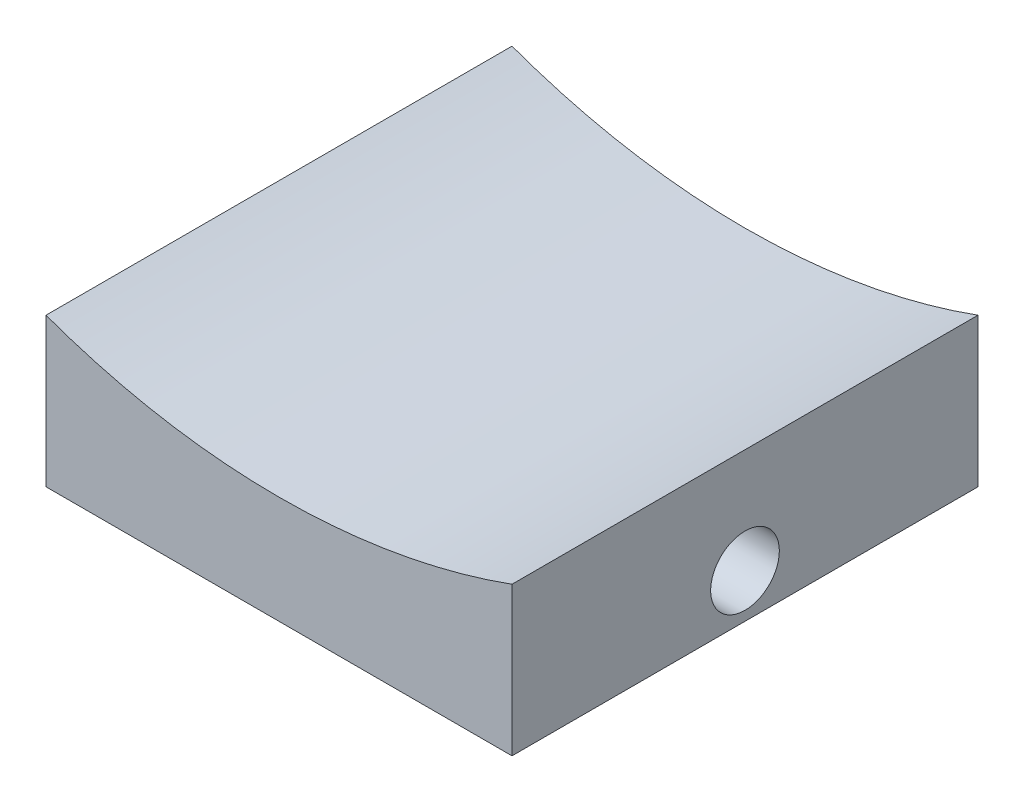
ISO-10303-21;
HEADER;
FILE_DESCRIPTION(('STEP AP214'),'2;1');
FILE_NAME('part.step','',(''),(''),'','','');
FILE_SCHEMA(('AUTOMOTIVE_DESIGN { 1 0 10303 214 1 1 1 1 }'));
ENDSEC;
DATA;
#1=APPLICATION_CONTEXT('core data for automotive mechanical design processes');
#2=APPLICATION_PROTOCOL_DEFINITION('international standard','automotive_design',2000,#1);
#3=PRODUCT_CONTEXT('',#1,'mechanical');
#4=PRODUCT('Part','Part','',(#3));
#5=PRODUCT_RELATED_PRODUCT_CATEGORY('part','',(#4));
#6=PRODUCT_DEFINITION_FORMATION('','',#4);
#7=PRODUCT_DEFINITION_CONTEXT('part definition',#1,'design');
#8=PRODUCT_DEFINITION('design','',#6,#7);
#9=PRODUCT_DEFINITION_SHAPE('','',#8);
#10=(LENGTH_UNIT() NAMED_UNIT(*) SI_UNIT(.MILLI.,.METRE.));
#11=(NAMED_UNIT(*) PLANE_ANGLE_UNIT() SI_UNIT($,.RADIAN.));
#12=(NAMED_UNIT(*) SI_UNIT($,.STERADIAN.) SOLID_ANGLE_UNIT());
#13=UNCERTAINTY_MEASURE_WITH_UNIT(LENGTH_MEASURE(1.E-05),#10,'distance_accuracy_value','');
#14=(GEOMETRIC_REPRESENTATION_CONTEXT(3) GLOBAL_UNCERTAINTY_ASSIGNED_CONTEXT((#13)) GLOBAL_UNIT_ASSIGNED_CONTEXT((#10,
#11,#12)) REPRESENTATION_CONTEXT('',''));
#15=CARTESIAN_POINT('',(0.,0.,0.));
#16=DIRECTION('',(0.,0.,1.));
#17=DIRECTION('',(1.,0.,0.));
#18=AXIS2_PLACEMENT_3D('',#15,#16,#17);
#19=CARTESIAN_POINT('',(-32.5,15.,65.));
#20=DIRECTION('',(1.,0.,0.));
#21=DIRECTION('',(0.,0.,-1.));
#22=AXIS2_PLACEMENT_3D('',#19,#20,#21);
#23=PLANE('',#22);
#24=DIRECTION('',(0.,-1.,0.));
#25=VECTOR('',#24,1.);
#26=CARTESIAN_POINT('',(-32.5,15.,65.));
#27=LINE('',#26,#25);
#28=CARTESIAN_POINT('',(-32.5,5.73214464321435,65.));
#29=VERTEX_POINT('',#28);
#30=CARTESIAN_POINT('',(-32.5,-15.,65.));
#31=VERTEX_POINT('',#30);
#32=EDGE_CURVE('E94',#29,#31,#27,.T.);
#33=ORIENTED_EDGE('',*,*,#32,.F.);
#34=DIRECTION('',(0.,0.,1.));
#35=VECTOR('',#34,1.);
#36=CARTESIAN_POINT('',(-32.5,5.73214464321435,0.));
#37=LINE('',#36,#35);
#38=CARTESIAN_POINT('',(-32.5,5.73214464321435,0.));
#39=VERTEX_POINT('',#38);
#40=EDGE_CURVE('E101',#29,#39,#37,.F.);
#41=ORIENTED_EDGE('',*,*,#40,.T.);
#42=DIRECTION('',(0.,-1.,0.));
#43=VECTOR('',#42,1.);
#44=CARTESIAN_POINT('',(-32.5,15.,0.));
#45=LINE('',#44,#43);
#46=CARTESIAN_POINT('',(-32.5,-15.,0.));
#47=VERTEX_POINT('',#46);
#48=EDGE_CURVE('E84',#39,#47,#45,.T.);
#49=ORIENTED_EDGE('',*,*,#48,.T.);
#50=DIRECTION('',(0.,0.,-1.));
#51=VECTOR('',#50,1.);
#52=CARTESIAN_POINT('',(-32.5,-15.,65.));
#53=LINE('',#52,#51);
#54=EDGE_CURVE('E11',#31,#47,#53,.T.);
#55=ORIENTED_EDGE('',*,*,#54,.F.);
#56=EDGE_LOOP('',(#33,#41,#49,#55));
#57=FACE_BOUND('',#56,.T.);
#58=ADVANCED_FACE('F38',(#57),#23,.F.);
#59=CARTESIAN_POINT('',(-32.5,-15.,65.));
#60=DIRECTION('',(0.,1.,0.));
#61=DIRECTION('',(0.,0.,1.));
#62=AXIS2_PLACEMENT_3D('',#59,#60,#61);
#63=PLANE('',#62);
#64=DIRECTION('',(1.,0.,0.));
#65=VECTOR('',#64,1.);
#66=CARTESIAN_POINT('',(-32.5,-15.,0.));
#67=LINE('',#66,#65);
#68=CARTESIAN_POINT('',(32.5,-15.,0.));
#69=VERTEX_POINT('',#68);
#70=EDGE_CURVE('E74',#47,#69,#67,.T.);
#71=ORIENTED_EDGE('',*,*,#70,.T.);
#72=DIRECTION('',(0.,0.,-1.));
#73=VECTOR('',#72,1.);
#74=CARTESIAN_POINT('',(32.5,-15.,65.));
#75=LINE('',#74,#73);
#76=CARTESIAN_POINT('',(32.5,-15.,65.));
#77=VERTEX_POINT('',#76);
#78=EDGE_CURVE('E46',#77,#69,#75,.T.);
#79=ORIENTED_EDGE('',*,*,#78,.F.);
#80=DIRECTION('',(1.,0.,0.));
#81=VECTOR('',#80,1.);
#82=CARTESIAN_POINT('',(-32.5,-15.,65.));
#83=LINE('',#82,#81);
#84=EDGE_CURVE('E62',#31,#77,#83,.T.);
#85=ORIENTED_EDGE('',*,*,#84,.F.);
#86=ORIENTED_EDGE('',*,*,#54,.T.);
#87=EDGE_LOOP('',(#71,#79,#85,#86));
#88=FACE_BOUND('',#87,.T.);
#89=ADVANCED_FACE('F76',(#88),#63,.F.);
#90=CARTESIAN_POINT('',(32.5,15.,65.));
#91=DIRECTION('',(-1.,0.,0.));
#92=DIRECTION('',(0.,0.,1.));
#93=AXIS2_PLACEMENT_3D('',#90,#91,#92);
#94=PLANE('',#93);
#95=CARTESIAN_POINT('',(32.5,-8.88,32.5));
#96=DIRECTION('',(1.,0.,0.));
#97=DIRECTION('',(0.,0.,-1.));
#98=AXIS2_PLACEMENT_3D('',#95,#96,#97);
#99=CIRCLE('',#98,4.79);
#100=CARTESIAN_POINT('',(32.5,-8.88,27.71));
#101=VERTEX_POINT('',#100);
#102=EDGE_CURVE('E117',#101,#101,#99,.T.);
#103=ORIENTED_EDGE('',*,*,#102,.F.);
#104=EDGE_LOOP('',(#103));
#105=FACE_BOUND('',#104,.T.);
#106=DIRECTION('',(0.,1.,0.));
#107=VECTOR('',#106,1.);
#108=CARTESIAN_POINT('',(32.5,15.,0.));
#109=LINE('',#108,#107);
#110=CARTESIAN_POINT('',(32.5,5.73214464321435,0.));
#111=VERTEX_POINT('',#110);
#112=EDGE_CURVE('E83',#69,#111,#109,.T.);
#113=ORIENTED_EDGE('',*,*,#112,.T.);
#114=DIRECTION('',(0.,0.,1.));
#115=VECTOR('',#114,1.);
#116=CARTESIAN_POINT('',(32.5,5.73214464321435,0.));
#117=LINE('',#116,#115);
#118=CARTESIAN_POINT('',(32.5,5.73214464321435,65.));
#119=VERTEX_POINT('',#118);
#120=EDGE_CURVE('E53',#111,#119,#117,.T.);
#121=ORIENTED_EDGE('',*,*,#120,.T.);
#122=DIRECTION('',(0.,1.,0.));
#123=VECTOR('',#122,1.);
#124=CARTESIAN_POINT('',(32.5,15.,65.));
#125=LINE('',#124,#123);
#126=EDGE_CURVE('E89',#77,#119,#125,.T.);
#127=ORIENTED_EDGE('',*,*,#126,.F.);
#128=ORIENTED_EDGE('',*,*,#78,.T.);
#129=EDGE_LOOP('',(#113,#121,#127,#128));
#130=FACE_BOUND('',#129,.T.);
#131=ADVANCED_FACE('F88',(#105,#130),#94,.F.);
#132=CARTESIAN_POINT('',(0.,0.,65.));
#133=DIRECTION('',(0.,0.,1.));
#134=DIRECTION('',(1.,0.,0.));
#135=AXIS2_PLACEMENT_3D('',#132,#133,#134);
#136=PLANE('',#135);
#137=CARTESIAN_POINT('',(0.,95.,65.));
#138=DIRECTION('',(0.,0.,1.));
#139=DIRECTION('',(1.,0.,0.));
#140=AXIS2_PLACEMENT_3D('',#137,#138,#139);
#141=CIRCLE('',#140,95.);
#142=EDGE_CURVE('E111',#29,#119,#141,.T.);
#143=ORIENTED_EDGE('',*,*,#142,.F.);
#144=ORIENTED_EDGE('',*,*,#32,.T.);
#145=ORIENTED_EDGE('',*,*,#84,.T.);
#146=ORIENTED_EDGE('',*,*,#126,.T.);
#147=EDGE_LOOP('',(#143,#144,#145,#146));
#148=FACE_BOUND('',#147,.T.);
#149=ADVANCED_FACE('F135',(#148),#136,.T.);
#150=CARTESIAN_POINT('',(0.,0.,0.));
#151=DIRECTION('',(0.,0.,1.));
#152=DIRECTION('',(1.,0.,0.));
#153=AXIS2_PLACEMENT_3D('',#150,#151,#152);
#154=PLANE('',#153);
#155=ORIENTED_EDGE('',*,*,#48,.F.);
#156=CARTESIAN_POINT('',(0.,95.,0.));
#157=DIRECTION('',(0.,0.,1.));
#158=DIRECTION('',(1.,0.,0.));
#159=AXIS2_PLACEMENT_3D('',#156,#157,#158);
#160=CIRCLE('',#159,95.);
#161=EDGE_CURVE('E92',#39,#111,#160,.T.);
#162=ORIENTED_EDGE('',*,*,#161,.T.);
#163=ORIENTED_EDGE('',*,*,#112,.F.);
#164=ORIENTED_EDGE('',*,*,#70,.F.);
#165=EDGE_LOOP('',(#155,#162,#163,#164));
#166=FACE_BOUND('',#165,.T.);
#167=ADVANCED_FACE('F91',(#166),#154,.F.);
#168=CARTESIAN_POINT('',(0.,95.,0.));
#169=DIRECTION('',(0.,0.,1.));
#170=DIRECTION('',(1.,0.,0.));
#171=AXIS2_PLACEMENT_3D('',#168,#169,#170);
#172=CYLINDRICAL_SURFACE('',#171,95.);
#173=ORIENTED_EDGE('',*,*,#142,.T.);
#174=ORIENTED_EDGE('',*,*,#120,.F.);
#175=ORIENTED_EDGE('',*,*,#161,.F.);
#176=ORIENTED_EDGE('',*,*,#40,.F.);
#177=EDGE_LOOP('',(#173,#174,#175,#176));
#178=FACE_BOUND('',#177,.T.);
#179=ADVANCED_FACE('F130',(#178),#172,.F.);
#180=CARTESIAN_POINT('',(-2.48,-8.88,32.5));
#181=DIRECTION('',(1.,0.,0.));
#182=DIRECTION('',(0.,0.,-1.));
#183=AXIS2_PLACEMENT_3D('',#180,#181,#182);
#184=CYLINDRICAL_SURFACE('',#183,4.79);
#185=CARTESIAN_POINT('',(-2.48,-8.88,32.5));
#186=DIRECTION('',(1.,0.,0.));
#187=DIRECTION('',(0.,0.,-1.));
#188=AXIS2_PLACEMENT_3D('',#185,#186,#187);
#189=CIRCLE('',#188,4.79);
#190=CARTESIAN_POINT('',(-2.48,-8.88,27.71));
#191=VERTEX_POINT('',#190);
#192=EDGE_CURVE('E114',#191,#191,#189,.T.);
#193=ORIENTED_EDGE('',*,*,#192,.F.);
#194=EDGE_LOOP('',(#193));
#195=FACE_BOUND('',#194,.T.);
#196=ORIENTED_EDGE('',*,*,#102,.T.);
#197=EDGE_LOOP('',(#196));
#198=FACE_BOUND('',#197,.T.);
#199=ADVANCED_FACE('F127',(#195,#198),#184,.F.);
#200=CARTESIAN_POINT('',(-2.48,-8.88,32.5));
#201=DIRECTION('',(1.,0.,0.));
#202=DIRECTION('',(0.,0.,-1.));
#203=AXIS2_PLACEMENT_3D('',#200,#201,#202);
#204=PLANE('',#203);
#205=ORIENTED_EDGE('',*,*,#192,.T.);
#206=EDGE_LOOP('',(#205));
#207=FACE_BOUND('',#206,.T.);
#208=ADVANCED_FACE('F125',(#207),#204,.T.);
#209=CLOSED_SHELL('',(#58,#89,#131,#149,#167,#179,#199,#208));
#210=MANIFOLD_SOLID_BREP('B2',#209);
#211=ADVANCED_BREP_SHAPE_REPRESENTATION('',(#18,#210),#14);
#212=SHAPE_DEFINITION_REPRESENTATION(#9,#211);
ENDSEC;
END-ISO-10303-21;
